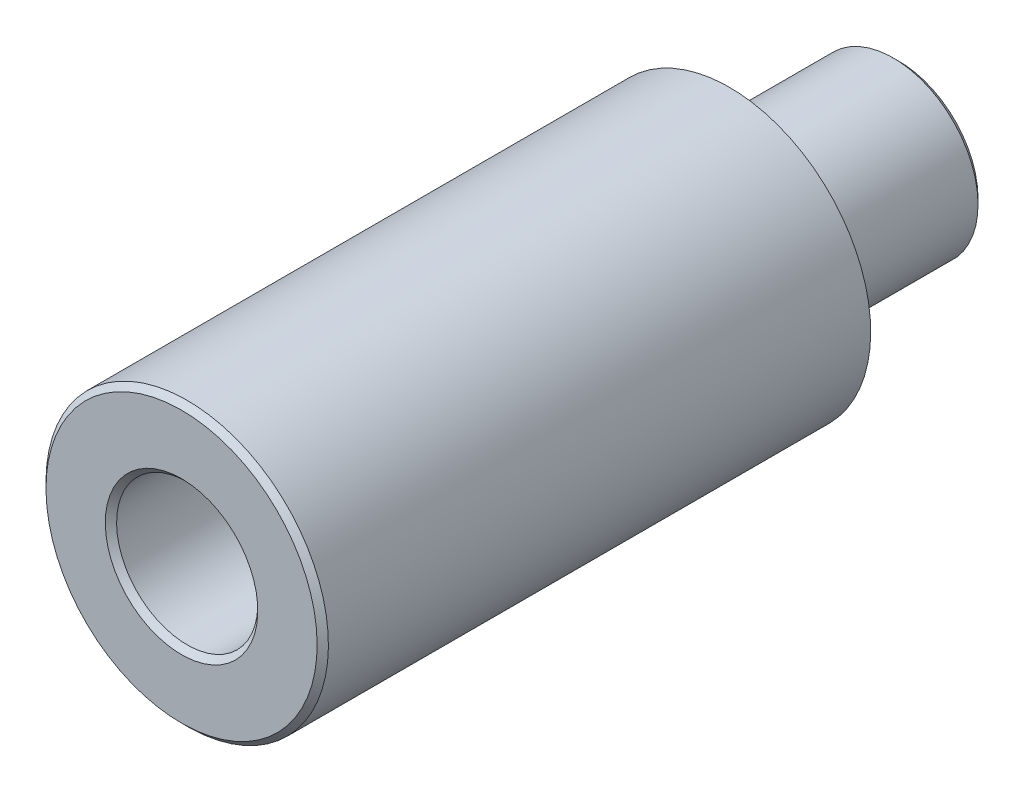
ISO-10303-21;
HEADER;
FILE_DESCRIPTION(('STEP AP214'),'2;1');
FILE_NAME('part.step','',(''),(''),'','','');
FILE_SCHEMA(('AUTOMOTIVE_DESIGN { 1 0 10303 214 1 1 1 1 }'));
ENDSEC;
DATA;
#1=APPLICATION_CONTEXT('core data for automotive mechanical design processes');
#2=APPLICATION_PROTOCOL_DEFINITION('international standard','automotive_design',2000,#1);
#3=PRODUCT_CONTEXT('',#1,'mechanical');
#4=PRODUCT('Part','Part','',(#3));
#5=PRODUCT_RELATED_PRODUCT_CATEGORY('part','',(#4));
#6=PRODUCT_DEFINITION_FORMATION('','',#4);
#7=PRODUCT_DEFINITION_CONTEXT('part definition',#1,'design');
#8=PRODUCT_DEFINITION('design','',#6,#7);
#9=PRODUCT_DEFINITION_SHAPE('','',#8);
#10=(LENGTH_UNIT() NAMED_UNIT(*) SI_UNIT(.MILLI.,.METRE.));
#11=(NAMED_UNIT(*) PLANE_ANGLE_UNIT() SI_UNIT($,.RADIAN.));
#12=(NAMED_UNIT(*) SI_UNIT($,.STERADIAN.) SOLID_ANGLE_UNIT());
#13=UNCERTAINTY_MEASURE_WITH_UNIT(LENGTH_MEASURE(1.E-05),#10,'distance_accuracy_value','');
#14=(GEOMETRIC_REPRESENTATION_CONTEXT(3) GLOBAL_UNCERTAINTY_ASSIGNED_CONTEXT((#13)) GLOBAL_UNIT_ASSIGNED_CONTEXT((#10,
#11,#12)) REPRESENTATION_CONTEXT('',''));
#15=CARTESIAN_POINT('',(0.,0.,0.));
#16=DIRECTION('',(0.,0.,1.));
#17=DIRECTION('',(1.,0.,0.));
#18=AXIS2_PLACEMENT_3D('',#15,#16,#17);
#19=CARTESIAN_POINT('',(0.,0.,78.849300195452));
#20=DIRECTION('',(0.,0.,1.));
#21=DIRECTION('',(-0.566980072134099,0.823731508322228,0.));
#22=AXIS2_PLACEMENT_3D('',#19,#20,#21);
#23=CONICAL_SURFACE('',#22,1.25,0.785398163397443);
#24=CARTESIAN_POINT('',(0.,0.,78.849300195452));
#25=DIRECTION('',(0.,0.,1.));
#26=DIRECTION('',(-0.566980072134099,0.823731508322228,0.));
#27=AXIS2_PLACEMENT_3D('',#24,#25,#26);
#28=CIRCLE('',#27,1.25);
#29=CARTESIAN_POINT('',(-0.708725090167623,1.02966438540278,78.849300195452));
#30=VERTEX_POINT('',#29);
#31=EDGE_CURVE('E11',#30,#30,#28,.T.);
#32=ORIENTED_EDGE('',*,*,#31,.F.);
#33=EDGE_LOOP('',(#32));
#34=FACE_BOUND('',#33,.T.);
#35=CARTESIAN_POINT('',(0.,0.,78.949300195452));
#36=DIRECTION('',(0.,0.,-1.));
#37=DIRECTION('',(-0.566980072134099,0.823731508322228,0.));
#38=AXIS2_PLACEMENT_3D('',#35,#36,#37);
#39=CIRCLE('',#38,1.35);
#40=CARTESIAN_POINT('',(-0.765423097381033,1.11203753623501,78.949300195452));
#41=VERTEX_POINT('',#40);
#42=EDGE_CURVE('E115',#41,#41,#39,.T.);
#43=ORIENTED_EDGE('',*,*,#42,.F.);
#44=EDGE_LOOP('',(#43));
#45=FACE_BOUND('',#44,.T.);
#46=ADVANCED_FACE('F36',(#34,#45),#23,.F.);
#47=CARTESIAN_POINT('',(0.,0.,66.249300195452));
#48=DIRECTION('',(0.,0.,1.));
#49=DIRECTION('',(-0.566980072134099,0.823731508322228,0.));
#50=AXIS2_PLACEMENT_3D('',#47,#48,#49);
#51=CONICAL_SURFACE('',#50,1.4,0.785398163397442);
#52=CARTESIAN_POINT('',(0.,0.,66.249300195452));
#53=DIRECTION('',(0.,0.,-1.));
#54=DIRECTION('',(0.566980072134099,-0.823731508322228,0.));
#55=AXIS2_PLACEMENT_3D('',#52,#53,#54);
#56=CIRCLE('',#55,1.4);
#57=CARTESIAN_POINT('',(0.793772100987738,-1.15322411165112,66.249300195452));
#58=VERTEX_POINT('',#57);
#59=EDGE_CURVE('E99',#58,#58,#56,.T.);
#60=ORIENTED_EDGE('',*,*,#59,.F.);
#61=EDGE_LOOP('',(#60));
#62=FACE_BOUND('',#61,.T.);
#63=CARTESIAN_POINT('',(0.,0.,66.349300195452));
#64=DIRECTION('',(0.,0.,1.));
#65=DIRECTION('',(0.566980072134099,-0.823731508322228,0.));
#66=AXIS2_PLACEMENT_3D('',#63,#64,#65);
#67=CIRCLE('',#66,1.5);
#68=CARTESIAN_POINT('',(0.850470108201148,-1.23559726248334,66.349300195452));
#69=VERTEX_POINT('',#68);
#70=EDGE_CURVE('E94',#69,#69,#67,.T.);
#71=ORIENTED_EDGE('',*,*,#70,.F.);
#72=EDGE_LOOP('',(#71));
#73=FACE_BOUND('',#72,.T.);
#74=ADVANCED_FACE('F151',(#62,#73),#51,.T.);
#75=CARTESIAN_POINT('',(0.,0.,78.949300195452));
#76=DIRECTION('',(0.,0.,-1.));
#77=DIRECTION('',(0.566980072134099,-0.823731508322228,0.));
#78=AXIS2_PLACEMENT_3D('',#75,#76,#77);
#79=CONICAL_SURFACE('',#78,2.4,0.785398163397438);
#80=CARTESIAN_POINT('',(0.,0.,78.949300195452));
#81=DIRECTION('',(0.,0.,1.));
#82=DIRECTION('',(-0.566980072134099,0.823731508322228,0.));
#83=AXIS2_PLACEMENT_3D('',#80,#81,#82);
#84=CIRCLE('',#83,2.4);
#85=CARTESIAN_POINT('',(-1.36075217312184,1.97695561997335,78.949300195452));
#86=VERTEX_POINT('',#85);
#87=EDGE_CURVE('E111',#86,#86,#84,.T.);
#88=ORIENTED_EDGE('',*,*,#87,.F.);
#89=EDGE_LOOP('',(#88));
#90=FACE_BOUND('',#89,.T.);
#91=CARTESIAN_POINT('',(0.,0.,78.849300195452));
#92=DIRECTION('',(0.,0.,-1.));
#93=DIRECTION('',(-0.566980072134099,0.823731508322228,0.));
#94=AXIS2_PLACEMENT_3D('',#91,#92,#93);
#95=CIRCLE('',#94,2.5);
#96=CARTESIAN_POINT('',(-1.41745018033525,2.05932877080557,78.849300195452));
#97=VERTEX_POINT('',#96);
#98=EDGE_CURVE('E107',#97,#97,#95,.T.);
#99=ORIENTED_EDGE('',*,*,#98,.F.);
#100=EDGE_LOOP('',(#99));
#101=FACE_BOUND('',#100,.T.);
#102=ADVANCED_FACE('F156',(#90,#101),#79,.T.);
#103=CARTESIAN_POINT('',(0.,0.,78.949300195452));
#104=DIRECTION('',(0.,0.,1.));
#105=DIRECTION('',(-0.566980072134099,0.823731508322228,0.));
#106=AXIS2_PLACEMENT_3D('',#103,#104,#105);
#107=CYLINDRICAL_SURFACE('',#106,1.25);
#108=ORIENTED_EDGE('',*,*,#31,.T.);
#109=EDGE_LOOP('',(#108));
#110=FACE_BOUND('',#109,.T.);
#111=CARTESIAN_POINT('',(0.,0.,71.449300195452));
#112=DIRECTION('',(0.,0.,1.));
#113=DIRECTION('',(-0.566980072134099,0.823731508322228,0.));
#114=AXIS2_PLACEMENT_3D('',#111,#112,#113);
#115=CIRCLE('',#114,1.25);
#116=CARTESIAN_POINT('',(-0.708725090167623,1.02966438540278,71.449300195452));
#117=VERTEX_POINT('',#116);
#118=EDGE_CURVE('E44',#117,#117,#115,.T.);
#119=ORIENTED_EDGE('',*,*,#118,.F.);
#120=EDGE_LOOP('',(#119));
#121=FACE_BOUND('',#120,.T.);
#122=ADVANCED_FACE('F165',(#110,#121),#107,.F.);
#123=CARTESIAN_POINT('',(0.,0.,71.449300195452));
#124=DIRECTION('',(0.,0.,1.));
#125=DIRECTION('',(-0.566980072134099,0.823731508322228,0.));
#126=AXIS2_PLACEMENT_3D('',#123,#124,#125);
#127=CONICAL_SURFACE('',#126,1.25,1.02974425867665);
#128=CARTESIAN_POINT('',(0.,0.,70.6982244216675));
#129=VERTEX_POINT('',#128);
#130=VERTEX_LOOP('',#129);
#131=FACE_BOUND('',#130,.T.);
#132=ORIENTED_EDGE('',*,*,#118,.T.);
#133=EDGE_LOOP('',(#132));
#134=FACE_BOUND('',#133,.T.);
#135=ADVANCED_FACE('F203',(#131,#134),#127,.F.);
#136=CARTESIAN_POINT('',(0.,0.,68.749300195452));
#137=DIRECTION('',(0.,0.,-1.));
#138=DIRECTION('',(0.823731508322228,0.566980072134099,0.));
#139=AXIS2_PLACEMENT_3D('',#136,#137,#138);
#140=PLANE('',#139);
#141=CARTESIAN_POINT('',(0.,0.,68.749300195452));
#142=DIRECTION('',(0.,0.,-1.));
#143=DIRECTION('',(0.566980072134099,-0.823731508322228,0.));
#144=AXIS2_PLACEMENT_3D('',#141,#142,#143);
#145=CIRCLE('',#144,1.25);
#146=CARTESIAN_POINT('',(0.708725090167623,-1.02966438540278,68.749300195452));
#147=VERTEX_POINT('',#146);
#148=EDGE_CURVE('E84',#147,#147,#145,.T.);
#149=ORIENTED_EDGE('',*,*,#148,.T.);
#150=EDGE_LOOP('',(#149));
#151=FACE_BOUND('',#150,.T.);
#152=CARTESIAN_POINT('',(0.,0.,68.749300195452));
#153=DIRECTION('',(0.,0.,-1.));
#154=DIRECTION('',(0.566980072134099,-0.823731508322228,0.));
#155=AXIS2_PLACEMENT_3D('',#152,#153,#154);
#156=CIRCLE('',#155,1.5);
#157=CARTESIAN_POINT('',(0.850470108201148,-1.23559726248334,68.749300195452));
#158=VERTEX_POINT('',#157);
#159=EDGE_CURVE('E90',#158,#158,#156,.T.);
#160=ORIENTED_EDGE('',*,*,#159,.F.);
#161=EDGE_LOOP('',(#160));
#162=FACE_BOUND('',#161,.T.);
#163=ADVANCED_FACE('F189',(#151,#162),#140,.F.);
#164=CARTESIAN_POINT('',(0.,0.,66.249300195452));
#165=DIRECTION('',(0.,0.,-1.));
#166=DIRECTION('',(0.823731508322228,0.566980072134099,0.));
#167=AXIS2_PLACEMENT_3D('',#164,#165,#166);
#168=PLANE('',#167);
#169=ORIENTED_EDGE('',*,*,#59,.T.);
#170=EDGE_LOOP('',(#169));
#171=FACE_BOUND('',#170,.T.);
#172=ADVANCED_FACE('F185',(#171),#168,.T.);
#173=CARTESIAN_POINT('',(0.,0.,66.249300195452));
#174=DIRECTION('',(0.,0.,1.));
#175=DIRECTION('',(-0.566980072134099,0.823731508322228,0.));
#176=AXIS2_PLACEMENT_3D('',#173,#174,#175);
#177=CYLINDRICAL_SURFACE('',#176,1.5);
#178=ORIENTED_EDGE('',*,*,#70,.T.);
#179=EDGE_LOOP('',(#178));
#180=FACE_BOUND('',#179,.T.);
#181=ORIENTED_EDGE('',*,*,#159,.T.);
#182=EDGE_LOOP('',(#181));
#183=FACE_BOUND('',#182,.T.);
#184=ADVANCED_FACE('F91',(#180,#183),#177,.T.);
#185=CARTESIAN_POINT('',(0.,0.,68.749300195452));
#186=DIRECTION('',(0.,0.,1.));
#187=DIRECTION('',(-0.566980072134099,0.823731508322228,0.));
#188=AXIS2_PLACEMENT_3D('',#185,#186,#187);
#189=CYLINDRICAL_SURFACE('',#188,1.25);
#190=ORIENTED_EDGE('',*,*,#148,.F.);
#191=EDGE_LOOP('',(#190));
#192=FACE_BOUND('',#191,.T.);
#193=CARTESIAN_POINT('',(0.,0.,69.249300195452));
#194=DIRECTION('',(0.,0.,-1.));
#195=DIRECTION('',(0.566980072134099,-0.823731508322228,0.));
#196=AXIS2_PLACEMENT_3D('',#193,#194,#195);
#197=CIRCLE('',#196,1.25);
#198=CARTESIAN_POINT('',(0.708725090167623,-1.02966438540278,69.249300195452));
#199=VERTEX_POINT('',#198);
#200=EDGE_CURVE('E101',#199,#199,#197,.T.);
#201=ORIENTED_EDGE('',*,*,#200,.T.);
#202=EDGE_LOOP('',(#201));
#203=FACE_BOUND('',#202,.T.);
#204=ADVANCED_FACE('F126',(#192,#203),#189,.T.);
#205=CARTESIAN_POINT('',(0.,0.,69.249300195452));
#206=DIRECTION('',(0.,0.,1.));
#207=DIRECTION('',(0.566980072134099,-0.823731508322228,0.));
#208=AXIS2_PLACEMENT_3D('',#205,#206,#207);
#209=PLANE('',#208);
#210=ORIENTED_EDGE('',*,*,#200,.F.);
#211=EDGE_LOOP('',(#210));
#212=FACE_BOUND('',#211,.T.);
#213=CARTESIAN_POINT('',(0.,0.,69.249300195452));
#214=DIRECTION('',(0.,0.,1.));
#215=DIRECTION('',(-0.566980072134099,0.823731508322228,0.));
#216=AXIS2_PLACEMENT_3D('',#213,#214,#215);
#217=CIRCLE('',#216,2.5);
#218=CARTESIAN_POINT('',(-1.41745018033525,2.05932877080557,69.249300195452));
#219=VERTEX_POINT('',#218);
#220=EDGE_CURVE('E104',#219,#219,#217,.T.);
#221=ORIENTED_EDGE('',*,*,#220,.F.);
#222=EDGE_LOOP('',(#221));
#223=FACE_BOUND('',#222,.T.);
#224=ADVANCED_FACE('F128',(#212,#223),#209,.F.);
#225=CARTESIAN_POINT('',(0.,0.,78.949300195452));
#226=DIRECTION('',(0.,0.,1.));
#227=DIRECTION('',(0.566980072134099,-0.823731508322228,0.));
#228=AXIS2_PLACEMENT_3D('',#225,#226,#227);
#229=PLANE('',#228);
#230=ORIENTED_EDGE('',*,*,#42,.T.);
#231=EDGE_LOOP('',(#230));
#232=FACE_BOUND('',#231,.T.);
#233=ORIENTED_EDGE('',*,*,#87,.T.);
#234=EDGE_LOOP('',(#233));
#235=FACE_BOUND('',#234,.T.);
#236=ADVANCED_FACE('F131',(#232,#235),#229,.T.);
#237=CARTESIAN_POINT('',(0.,0.,78.949300195452));
#238=DIRECTION('',(0.,0.,-1.));
#239=DIRECTION('',(0.566980072134099,-0.823731508322228,0.));
#240=AXIS2_PLACEMENT_3D('',#237,#238,#239);
#241=CYLINDRICAL_SURFACE('',#240,2.5);
#242=ORIENTED_EDGE('',*,*,#98,.T.);
#243=EDGE_LOOP('',(#242));
#244=FACE_BOUND('',#243,.T.);
#245=ORIENTED_EDGE('',*,*,#220,.T.);
#246=EDGE_LOOP('',(#245));
#247=FACE_BOUND('',#246,.T.);
#248=ADVANCED_FACE('F139',(#244,#247),#241,.T.);
#249=CLOSED_SHELL('',(#46,#74,#102,#122,#135,#163,#172,#184,#204,#224,#236,#248));
#250=MANIFOLD_SOLID_BREP('B2',#249);
#251=ADVANCED_BREP_SHAPE_REPRESENTATION('',(#18,#250),#14);
#252=SHAPE_DEFINITION_REPRESENTATION(#9,#251);
ENDSEC;
END-ISO-10303-21;
